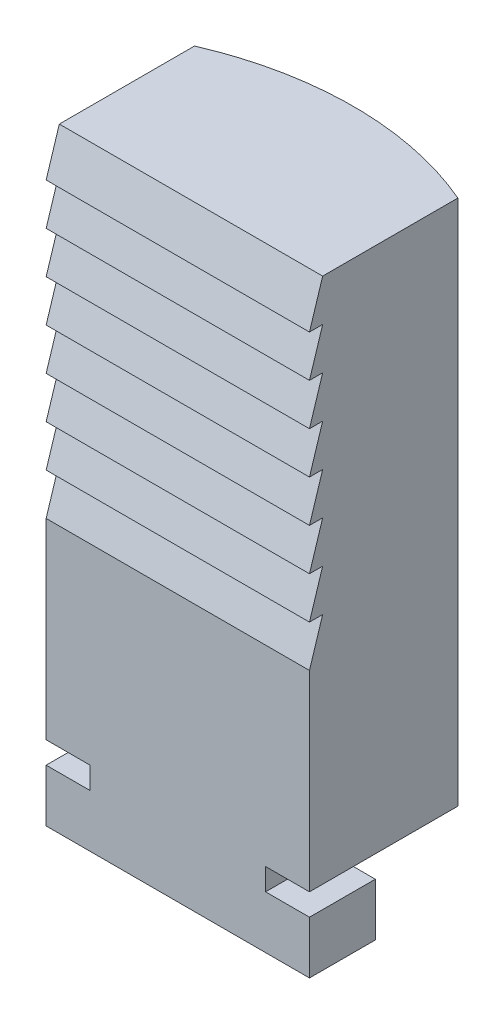
ISO-10303-21;
HEADER;
FILE_DESCRIPTION(('STEP AP214'),'2;1');
FILE_NAME('part.step','',(''),(''),'','','');
FILE_SCHEMA(('AUTOMOTIVE_DESIGN { 1 0 10303 214 1 1 1 1 }'));
ENDSEC;
DATA;
#1=APPLICATION_CONTEXT('core data for automotive mechanical design processes');
#2=APPLICATION_PROTOCOL_DEFINITION('international standard','automotive_design',2000,#1);
#3=PRODUCT_CONTEXT('',#1,'mechanical');
#4=PRODUCT('Part','Part','',(#3));
#5=PRODUCT_RELATED_PRODUCT_CATEGORY('part','',(#4));
#6=PRODUCT_DEFINITION_FORMATION('','',#4);
#7=PRODUCT_DEFINITION_CONTEXT('part definition',#1,'design');
#8=PRODUCT_DEFINITION('design','',#6,#7);
#9=PRODUCT_DEFINITION_SHAPE('','',#8);
#10=(LENGTH_UNIT() NAMED_UNIT(*) SI_UNIT(.MILLI.,.METRE.));
#11=(NAMED_UNIT(*) PLANE_ANGLE_UNIT() SI_UNIT($,.RADIAN.));
#12=(NAMED_UNIT(*) SI_UNIT($,.STERADIAN.) SOLID_ANGLE_UNIT());
#13=UNCERTAINTY_MEASURE_WITH_UNIT(LENGTH_MEASURE(1.E-05),#10,'distance_accuracy_value','');
#14=(GEOMETRIC_REPRESENTATION_CONTEXT(3) GLOBAL_UNCERTAINTY_ASSIGNED_CONTEXT((#13)) GLOBAL_UNIT_ASSIGNED_CONTEXT((#10,
#11,#12)) REPRESENTATION_CONTEXT('',''));
#15=CARTESIAN_POINT('',(0.,0.,0.));
#16=DIRECTION('',(0.,0.,1.));
#17=DIRECTION('',(1.,0.,0.));
#18=AXIS2_PLACEMENT_3D('',#15,#16,#17);
#19=CARTESIAN_POINT('',(0.,12.,40.));
#20=DIRECTION('',(1.,0.,0.));
#21=DIRECTION('',(0.,0.,-1.));
#22=AXIS2_PLACEMENT_3D('',#19,#20,#21);
#23=PLANE('',#22);
#24=DIRECTION('',(0.,1.,0.));
#25=VECTOR('',#24,1.);
#26=CARTESIAN_POINT('',(0.,0.,25.));
#27=LINE('',#26,#25);
#28=CARTESIAN_POINT('',(0.,0.,25.));
#29=VERTEX_POINT('',#28);
#30=CARTESIAN_POINT('',(0.,12.,25.));
#31=VERTEX_POINT('',#30);
#32=EDGE_CURVE('E289',#29,#31,#27,.T.);
#33=ORIENTED_EDGE('',*,*,#32,.F.);
#34=DIRECTION('',(0.,0.,-1.));
#35=VECTOR('',#34,1.);
#36=CARTESIAN_POINT('',(0.,0.,40.));
#37=LINE('',#36,#35);
#38=CARTESIAN_POINT('',(0.,0.,40.));
#39=VERTEX_POINT('',#38);
#40=EDGE_CURVE('E11',#39,#29,#37,.T.);
#41=ORIENTED_EDGE('',*,*,#40,.F.);
#42=DIRECTION('',(0.,-1.,0.));
#43=VECTOR('',#42,1.);
#44=CARTESIAN_POINT('',(0.,12.,40.));
#45=LINE('',#44,#43);
#46=CARTESIAN_POINT('',(0.,12.,40.));
#47=VERTEX_POINT('',#46);
#48=EDGE_CURVE('E462',#47,#39,#45,.T.);
#49=ORIENTED_EDGE('',*,*,#48,.F.);
#50=DIRECTION('',(0.,0.,-1.));
#51=VECTOR('',#50,1.);
#52=CARTESIAN_POINT('',(0.,12.,40.));
#53=LINE('',#52,#51);
#54=EDGE_CURVE('E494',#47,#31,#53,.T.);
#55=ORIENTED_EDGE('',*,*,#54,.T.);
#56=EDGE_LOOP('',(#33,#41,#49,#55));
#57=FACE_BOUND('',#56,.T.);
#58=ADVANCED_FACE('F43',(#57),#23,.F.);
#59=CARTESIAN_POINT('',(0.,0.,40.));
#60=DIRECTION('',(0.,1.,0.));
#61=DIRECTION('',(0.,0.,1.));
#62=AXIS2_PLACEMENT_3D('',#59,#60,#61);
#63=PLANE('',#62);
#64=DIRECTION('',(-1.,0.,0.));
#65=VECTOR('',#64,1.);
#66=CARTESIAN_POINT('',(60.,0.,25.));
#67=LINE('',#66,#65);
#68=CARTESIAN_POINT('',(60.,0.,25.));
#69=VERTEX_POINT('',#68);
#70=EDGE_CURVE('E284',#69,#29,#67,.T.);
#71=ORIENTED_EDGE('',*,*,#70,.F.);
#72=DIRECTION('',(0.,0.,-1.));
#73=VECTOR('',#72,1.);
#74=CARTESIAN_POINT('',(60.,0.,40.));
#75=LINE('',#74,#73);
#76=CARTESIAN_POINT('',(60.,0.,40.));
#77=VERTEX_POINT('',#76);
#78=EDGE_CURVE('E51',#77,#69,#75,.T.);
#79=ORIENTED_EDGE('',*,*,#78,.F.);
#80=DIRECTION('',(1.,0.,0.));
#81=VECTOR('',#80,1.);
#82=CARTESIAN_POINT('',(0.,0.,40.));
#83=LINE('',#82,#81);
#84=EDGE_CURVE('E282',#39,#77,#83,.T.);
#85=ORIENTED_EDGE('',*,*,#84,.F.);
#86=ORIENTED_EDGE('',*,*,#40,.T.);
#87=EDGE_LOOP('',(#71,#79,#85,#86));
#88=FACE_BOUND('',#87,.T.);
#89=ADVANCED_FACE('F281',(#88),#63,.F.);
#90=CARTESIAN_POINT('',(60.,0.,40.));
#91=DIRECTION('',(-1.,0.,0.));
#92=DIRECTION('',(0.,0.,1.));
#93=AXIS2_PLACEMENT_3D('',#90,#91,#92);
#94=PLANE('',#93);
#95=DIRECTION('',(0.,-1.,0.));
#96=VECTOR('',#95,1.);
#97=CARTESIAN_POINT('',(60.,12.,25.));
#98=LINE('',#97,#96);
#99=CARTESIAN_POINT('',(60.,12.,25.));
#100=VERTEX_POINT('',#99);
#101=EDGE_CURVE('E277',#100,#69,#98,.T.);
#102=ORIENTED_EDGE('',*,*,#101,.F.);
#103=DIRECTION('',(0.,0.,-1.));
#104=VECTOR('',#103,1.);
#105=CARTESIAN_POINT('',(60.,12.,40.));
#106=LINE('',#105,#104);
#107=CARTESIAN_POINT('',(60.,12.,40.));
#108=VERTEX_POINT('',#107);
#109=EDGE_CURVE('E266',#108,#100,#106,.T.);
#110=ORIENTED_EDGE('',*,*,#109,.F.);
#111=DIRECTION('',(0.,1.,0.));
#112=VECTOR('',#111,1.);
#113=CARTESIAN_POINT('',(60.,0.,40.));
#114=LINE('',#113,#112);
#115=EDGE_CURVE('E278',#77,#108,#114,.T.);
#116=ORIENTED_EDGE('',*,*,#115,.F.);
#117=ORIENTED_EDGE('',*,*,#78,.T.);
#118=EDGE_LOOP('',(#102,#110,#116,#117));
#119=FACE_BOUND('',#118,.T.);
#120=ADVANCED_FACE('F275',(#119),#94,.F.);
#121=CARTESIAN_POINT('',(60.,12.,40.));
#122=DIRECTION('',(0.,-1.,0.));
#123=DIRECTION('',(1.,0.,0.));
#124=AXIS2_PLACEMENT_3D('',#121,#122,#123);
#125=PLANE('',#124);
#126=DIRECTION('',(1.,0.,0.));
#127=VECTOR('',#126,1.);
#128=CARTESIAN_POINT('',(50.,12.,25.));
#129=LINE('',#128,#127);
#130=CARTESIAN_POINT('',(50.,12.,25.));
#131=VERTEX_POINT('',#130);
#132=EDGE_CURVE('E310',#131,#100,#129,.T.);
#133=ORIENTED_EDGE('',*,*,#132,.F.);
#134=DIRECTION('',(0.,0.,-1.));
#135=VECTOR('',#134,1.);
#136=CARTESIAN_POINT('',(50.,12.,40.));
#137=LINE('',#136,#135);
#138=CARTESIAN_POINT('',(50.,12.,40.));
#139=VERTEX_POINT('',#138);
#140=EDGE_CURVE('E262',#139,#131,#137,.T.);
#141=ORIENTED_EDGE('',*,*,#140,.F.);
#142=DIRECTION('',(-1.,0.,0.));
#143=VECTOR('',#142,1.);
#144=CARTESIAN_POINT('',(60.,12.,40.));
#145=LINE('',#144,#143);
#146=EDGE_CURVE('E469',#108,#139,#145,.T.);
#147=ORIENTED_EDGE('',*,*,#146,.F.);
#148=ORIENTED_EDGE('',*,*,#109,.T.);
#149=EDGE_LOOP('',(#133,#141,#147,#148));
#150=FACE_BOUND('',#149,.T.);
#151=ADVANCED_FACE('F598',(#150),#125,.F.);
#152=CARTESIAN_POINT('',(50.,12.,40.));
#153=DIRECTION('',(-1.,0.,0.));
#154=DIRECTION('',(0.,0.,1.));
#155=AXIS2_PLACEMENT_3D('',#152,#153,#154);
#156=PLANE('',#155);
#157=DIRECTION('',(0.,-1.,0.));
#158=VECTOR('',#157,1.);
#159=CARTESIAN_POINT('',(50.,17.,25.));
#160=LINE('',#159,#158);
#161=CARTESIAN_POINT('',(50.,17.,25.));
#162=VERTEX_POINT('',#161);
#163=EDGE_CURVE('E307',#162,#131,#160,.T.);
#164=ORIENTED_EDGE('',*,*,#163,.F.);
#165=DIRECTION('',(0.,0.,-1.));
#166=VECTOR('',#165,1.);
#167=CARTESIAN_POINT('',(50.,17.,40.));
#168=LINE('',#167,#166);
#169=CARTESIAN_POINT('',(50.,17.,40.));
#170=VERTEX_POINT('',#169);
#171=EDGE_CURVE('E253',#170,#162,#168,.T.);
#172=ORIENTED_EDGE('',*,*,#171,.F.);
#173=DIRECTION('',(0.,1.,0.));
#174=VECTOR('',#173,1.);
#175=CARTESIAN_POINT('',(50.,12.,40.));
#176=LINE('',#175,#174);
#177=EDGE_CURVE('E472',#139,#170,#176,.T.);
#178=ORIENTED_EDGE('',*,*,#177,.F.);
#179=ORIENTED_EDGE('',*,*,#140,.T.);
#180=EDGE_LOOP('',(#164,#172,#178,#179));
#181=FACE_BOUND('',#180,.T.);
#182=ADVANCED_FACE('F593',(#181),#156,.F.);
#183=CARTESIAN_POINT('',(10.,17.,40.));
#184=DIRECTION('',(1.,0.,0.));
#185=DIRECTION('',(0.,0.,-1.));
#186=AXIS2_PLACEMENT_3D('',#183,#184,#185);
#187=PLANE('',#186);
#188=DIRECTION('',(0.,1.,0.));
#189=VECTOR('',#188,1.);
#190=CARTESIAN_POINT('',(10.,12.,25.));
#191=LINE('',#190,#189);
#192=CARTESIAN_POINT('',(10.,12.,25.));
#193=VERTEX_POINT('',#192);
#194=CARTESIAN_POINT('',(10.,17.,25.));
#195=VERTEX_POINT('',#194);
#196=EDGE_CURVE('E300',#193,#195,#191,.T.);
#197=ORIENTED_EDGE('',*,*,#196,.F.);
#198=DIRECTION('',(0.,0.,-1.));
#199=VECTOR('',#198,1.);
#200=CARTESIAN_POINT('',(10.,12.,40.));
#201=LINE('',#200,#199);
#202=CARTESIAN_POINT('',(10.,12.,40.));
#203=VERTEX_POINT('',#202);
#204=EDGE_CURVE('E498',#203,#193,#201,.T.);
#205=ORIENTED_EDGE('',*,*,#204,.F.);
#206=DIRECTION('',(0.,-1.,0.));
#207=VECTOR('',#206,1.);
#208=CARTESIAN_POINT('',(10.,17.,40.));
#209=LINE('',#208,#207);
#210=CARTESIAN_POINT('',(10.,17.,40.));
#211=VERTEX_POINT('',#210);
#212=EDGE_CURVE('E488',#211,#203,#209,.T.);
#213=ORIENTED_EDGE('',*,*,#212,.F.);
#214=DIRECTION('',(0.,0.,-1.));
#215=VECTOR('',#214,1.);
#216=CARTESIAN_POINT('',(10.,17.,40.));
#217=LINE('',#216,#215);
#218=EDGE_CURVE('E502',#211,#195,#217,.T.);
#219=ORIENTED_EDGE('',*,*,#218,.T.);
#220=EDGE_LOOP('',(#197,#205,#213,#219));
#221=FACE_BOUND('',#220,.T.);
#222=ADVANCED_FACE('F611',(#221),#187,.F.);
#223=CARTESIAN_POINT('',(10.,12.,40.));
#224=DIRECTION('',(0.,-1.,0.));
#225=DIRECTION('',(0.,0.,-1.));
#226=AXIS2_PLACEMENT_3D('',#223,#224,#225);
#227=PLANE('',#226);
#228=DIRECTION('',(1.,0.,0.));
#229=VECTOR('',#228,1.);
#230=CARTESIAN_POINT('',(0.,12.,25.));
#231=LINE('',#230,#229);
#232=EDGE_CURVE('E293',#31,#193,#231,.T.);
#233=ORIENTED_EDGE('',*,*,#232,.F.);
#234=ORIENTED_EDGE('',*,*,#54,.F.);
#235=DIRECTION('',(-1.,0.,0.));
#236=VECTOR('',#235,1.);
#237=CARTESIAN_POINT('',(10.,12.,40.));
#238=LINE('',#237,#236);
#239=EDGE_CURVE('E491',#203,#47,#238,.T.);
#240=ORIENTED_EDGE('',*,*,#239,.F.);
#241=ORIENTED_EDGE('',*,*,#204,.T.);
#242=EDGE_LOOP('',(#233,#234,#240,#241));
#243=FACE_BOUND('',#242,.T.);
#244=ADVANCED_FACE('F607',(#243),#227,.F.);
#245=CARTESIAN_POINT('',(60.,17.,40.));
#246=DIRECTION('',(-1.,0.,0.));
#247=DIRECTION('',(0.,0.,1.));
#248=AXIS2_PLACEMENT_3D('',#245,#246,#247);
#249=PLANE('',#248);
#250=DIRECTION('',(0.,0.,-1.));
#251=VECTOR('',#250,1.);
#252=CARTESIAN_POINT('',(60.,17.,40.));
#253=LINE('',#252,#251);
#254=CARTESIAN_POINT('',(60.,17.,40.));
#255=VERTEX_POINT('',#254);
#256=CARTESIAN_POINT('',(60.,17.,6.19377739427172));
#257=VERTEX_POINT('',#256);
#258=EDGE_CURVE('E242',#255,#257,#253,.T.);
#259=ORIENTED_EDGE('',*,*,#258,.T.);
#260=DIRECTION('',(0.,1.,0.));
#261=VECTOR('',#260,1.);
#262=CARTESIAN_POINT('',(60.,0.,6.19377739427172));
#263=LINE('',#262,#261);
#264=CARTESIAN_POINT('',(60.,137.,6.19377739427172));
#265=VERTEX_POINT('',#264);
#266=EDGE_CURVE('E226',#257,#265,#263,.T.);
#267=ORIENTED_EDGE('',*,*,#266,.T.);
#268=DIRECTION('',(0.,0.,-1.));
#269=VECTOR('',#268,1.);
#270=CARTESIAN_POINT('',(60.,137.,40.));
#271=LINE('',#270,#269);
#272=CARTESIAN_POINT('',(60.,137.,37.0000000000003));
#273=VERTEX_POINT('',#272);
#274=EDGE_CURVE('E240',#273,#265,#271,.T.);
#275=ORIENTED_EDGE('',*,*,#274,.F.);
#276=DIRECTION('',(0.,0.953939201416954,-0.299999999999975));
#277=VECTOR('',#276,1.);
#278=CARTESIAN_POINT('',(60.,137.,37.0000000000003));
#279=LINE('',#278,#277);
#280=CARTESIAN_POINT('',(60.,127.460607985831,40.));
#281=VERTEX_POINT('',#280);
#282=EDGE_CURVE('E355',#281,#273,#279,.T.);
#283=ORIENTED_EDGE('',*,*,#282,.F.);
#284=DIRECTION('',(0.,0.,1.));
#285=VECTOR('',#284,1.);
#286=CARTESIAN_POINT('',(60.,127.460607985831,40.));
#287=LINE('',#286,#285);
#288=CARTESIAN_POINT('',(60.,127.460607985831,37.0000000000001));
#289=VERTEX_POINT('',#288);
#290=EDGE_CURVE('E352',#289,#281,#287,.T.);
#291=ORIENTED_EDGE('',*,*,#290,.F.);
#292=DIRECTION('',(0.,0.953939201416951,-0.299999999999982));
#293=VECTOR('',#292,1.);
#294=CARTESIAN_POINT('',(60.,127.460607985831,37.0000000000001));
#295=LINE('',#294,#293);
#296=CARTESIAN_POINT('',(60.,117.921215971661,40.0000000000001));
#297=VERTEX_POINT('',#296);
#298=EDGE_CURVE('E349',#297,#289,#295,.T.);
#299=ORIENTED_EDGE('',*,*,#298,.F.);
#300=DIRECTION('',(0.,0.,1.));
#301=VECTOR('',#300,1.);
#302=CARTESIAN_POINT('',(60.,117.921215971661,40.0000000000001));
#303=LINE('',#302,#301);
#304=CARTESIAN_POINT('',(60.,117.921215971661,37.0000000000001));
#305=VERTEX_POINT('',#304);
#306=EDGE_CURVE('E346',#305,#297,#303,.T.);
#307=ORIENTED_EDGE('',*,*,#306,.F.);
#308=DIRECTION('',(0.,0.953939201416952,-0.29999999999998));
#309=VECTOR('',#308,1.);
#310=CARTESIAN_POINT('',(60.,117.921215971661,37.0000000000001));
#311=LINE('',#310,#309);
#312=CARTESIAN_POINT('',(60.,108.381823957491,40.));
#313=VERTEX_POINT('',#312);
#314=EDGE_CURVE('E343',#313,#305,#311,.T.);
#315=ORIENTED_EDGE('',*,*,#314,.F.);
#316=DIRECTION('',(0.,0.,1.));
#317=VECTOR('',#316,1.);
#318=CARTESIAN_POINT('',(60.,108.381823957491,40.));
#319=LINE('',#318,#317);
#320=CARTESIAN_POINT('',(60.,108.381823957491,37.));
#321=VERTEX_POINT('',#320);
#322=EDGE_CURVE('E340',#321,#313,#319,.T.);
#323=ORIENTED_EDGE('',*,*,#322,.F.);
#324=DIRECTION('',(0.,0.953939201416951,-0.299999999999982));
#325=VECTOR('',#324,1.);
#326=CARTESIAN_POINT('',(60.,108.381823957491,37.));
#327=LINE('',#326,#325);
#328=CARTESIAN_POINT('',(60.,98.8424319433208,40.0000000000001));
#329=VERTEX_POINT('',#328);
#330=EDGE_CURVE('E337',#329,#321,#327,.T.);
#331=ORIENTED_EDGE('',*,*,#330,.F.);
#332=DIRECTION('',(0.,0.,1.));
#333=VECTOR('',#332,1.);
#334=CARTESIAN_POINT('',(60.,98.8424319433208,40.0000000000001));
#335=LINE('',#334,#333);
#336=CARTESIAN_POINT('',(60.,98.8424319433208,37.));
#337=VERTEX_POINT('',#336);
#338=EDGE_CURVE('E334',#337,#329,#335,.T.);
#339=ORIENTED_EDGE('',*,*,#338,.F.);
#340=DIRECTION('',(0.,0.953939201416952,-0.299999999999979));
#341=VECTOR('',#340,1.);
#342=CARTESIAN_POINT('',(60.,98.8424319433208,37.));
#343=LINE('',#342,#341);
#344=CARTESIAN_POINT('',(60.,89.3030399291507,40.));
#345=VERTEX_POINT('',#344);
#346=EDGE_CURVE('E331',#345,#337,#343,.T.);
#347=ORIENTED_EDGE('',*,*,#346,.F.);
#348=DIRECTION('',(0.,0.,1.));
#349=VECTOR('',#348,1.);
#350=CARTESIAN_POINT('',(60.,89.3030399291507,40.));
#351=LINE('',#350,#349);
#352=CARTESIAN_POINT('',(60.,89.3030399291507,37.));
#353=VERTEX_POINT('',#352);
#354=EDGE_CURVE('E328',#353,#345,#351,.T.);
#355=ORIENTED_EDGE('',*,*,#354,.F.);
#356=DIRECTION('',(0.,0.953939201416952,-0.29999999999998));
#357=VECTOR('',#356,1.);
#358=CARTESIAN_POINT('',(60.,89.3030399291507,37.));
#359=LINE('',#358,#357);
#360=CARTESIAN_POINT('',(60.,79.7636479149805,40.));
#361=VERTEX_POINT('',#360);
#362=EDGE_CURVE('E325',#361,#353,#359,.T.);
#363=ORIENTED_EDGE('',*,*,#362,.F.);
#364=DIRECTION('',(0.,0.,1.));
#365=VECTOR('',#364,1.);
#366=CARTESIAN_POINT('',(60.,79.7636479149805,40.));
#367=LINE('',#366,#365);
#368=CARTESIAN_POINT('',(60.,79.7636479149805,37.));
#369=VERTEX_POINT('',#368);
#370=EDGE_CURVE('E322',#369,#361,#367,.T.);
#371=ORIENTED_EDGE('',*,*,#370,.F.);
#372=DIRECTION('',(0.,0.953939201416952,-0.299999999999979));
#373=VECTOR('',#372,1.);
#374=CARTESIAN_POINT('',(60.,79.7636479149805,37.));
#375=LINE('',#374,#373);
#376=CARTESIAN_POINT('',(60.,70.2242559008102,40.));
#377=VERTEX_POINT('',#376);
#378=EDGE_CURVE('E319',#377,#369,#375,.T.);
#379=ORIENTED_EDGE('',*,*,#378,.F.);
#380=DIRECTION('',(0.,0.,1.));
#381=VECTOR('',#380,1.);
#382=CARTESIAN_POINT('',(60.,70.2242559008102,40.));
#383=LINE('',#382,#381);
#384=CARTESIAN_POINT('',(60.,70.2242559008102,37.));
#385=VERTEX_POINT('',#384);
#386=EDGE_CURVE('E316',#385,#377,#383,.T.);
#387=ORIENTED_EDGE('',*,*,#386,.F.);
#388=DIRECTION('',(0.,0.953939201416953,-0.299999999999977));
#389=VECTOR('',#388,1.);
#390=CARTESIAN_POINT('',(60.,70.2242559008102,37.));
#391=LINE('',#390,#389);
#392=CARTESIAN_POINT('',(60.,60.6848638866399,40.));
#393=VERTEX_POINT('',#392);
#394=EDGE_CURVE('E313',#393,#385,#391,.T.);
#395=ORIENTED_EDGE('',*,*,#394,.F.);
#396=DIRECTION('',(0.,1.,0.));
#397=VECTOR('',#396,1.);
#398=CARTESIAN_POINT('',(60.,17.,40.));
#399=LINE('',#398,#397);
#400=EDGE_CURVE('E478',#255,#393,#399,.T.);
#401=ORIENTED_EDGE('',*,*,#400,.F.);
#402=EDGE_LOOP('',(#259,#267,#275,#283,#291,#299,#307,#315,#323,#331,#339,#347,#355,#363,#371,
#379,#387,#395,#401));
#403=FACE_BOUND('',#402,.T.);
#404=ADVANCED_FACE('F238',(#403),#249,.F.);
#405=CARTESIAN_POINT('',(60.,137.,40.));
#406=DIRECTION('',(0.,-1.,0.));
#407=DIRECTION('',(0.,0.,-1.));
#408=AXIS2_PLACEMENT_3D('',#405,#406,#407);
#409=PLANE('',#408);
#410=CARTESIAN_POINT('',(30.,137.,75.7504523231356));
#411=DIRECTION('',(0.,-1.,0.));
#412=DIRECTION('',(0.,0.,1.));
#413=AXIS2_PLACEMENT_3D('',#410,#411,#412);
#414=CIRCLE('',#413,75.7504523231356);
#415=CARTESIAN_POINT('',(0.,137.,6.19377739427172));
#416=VERTEX_POINT('',#415);
#417=EDGE_CURVE('E223',#416,#265,#414,.T.);
#418=ORIENTED_EDGE('',*,*,#417,.F.);
#419=DIRECTION('',(0.,0.,-1.));
#420=VECTOR('',#419,1.);
#421=CARTESIAN_POINT('',(0.,137.,40.));
#422=LINE('',#421,#420);
#423=CARTESIAN_POINT('',(0.,137.,37.0000000000003));
#424=VERTEX_POINT('',#423);
#425=EDGE_CURVE('E249',#424,#416,#422,.T.);
#426=ORIENTED_EDGE('',*,*,#425,.F.);
#427=DIRECTION('',(-1.,0.,0.));
#428=VECTOR('',#427,1.);
#429=CARTESIAN_POINT('',(60.,137.,37.0000000000003));
#430=LINE('',#429,#428);
#431=EDGE_CURVE('E247',#273,#424,#430,.T.);
#432=ORIENTED_EDGE('',*,*,#431,.F.);
#433=ORIENTED_EDGE('',*,*,#274,.T.);
#434=EDGE_LOOP('',(#418,#426,#432,#433));
#435=FACE_BOUND('',#434,.T.);
#436=ADVANCED_FACE('F246',(#435),#409,.F.);
#437=CARTESIAN_POINT('',(0.,137.,40.));
#438=DIRECTION('',(1.,0.,0.));
#439=DIRECTION('',(0.,0.,-1.));
#440=AXIS2_PLACEMENT_3D('',#437,#438,#439);
#441=PLANE('',#440);
#442=ORIENTED_EDGE('',*,*,#425,.T.);
#443=DIRECTION('',(0.,1.,0.));
#444=VECTOR('',#443,1.);
#445=CARTESIAN_POINT('',(0.,0.,6.19377739427172));
#446=LINE('',#445,#444);
#447=CARTESIAN_POINT('',(0.,17.,6.19377739427172));
#448=VERTEX_POINT('',#447);
#449=EDGE_CURVE('E229',#448,#416,#446,.T.);
#450=ORIENTED_EDGE('',*,*,#449,.F.);
#451=DIRECTION('',(0.,0.,-1.));
#452=VECTOR('',#451,1.);
#453=CARTESIAN_POINT('',(0.,17.,40.));
#454=LINE('',#453,#452);
#455=CARTESIAN_POINT('',(0.,17.,40.));
#456=VERTEX_POINT('',#455);
#457=EDGE_CURVE('E255',#456,#448,#454,.T.);
#458=ORIENTED_EDGE('',*,*,#457,.F.);
#459=DIRECTION('',(0.,-1.,0.));
#460=VECTOR('',#459,1.);
#461=CARTESIAN_POINT('',(0.,137.,40.));
#462=LINE('',#461,#460);
#463=CARTESIAN_POINT('',(0.,60.68486388664,40.));
#464=VERTEX_POINT('',#463);
#465=EDGE_CURVE('E482',#464,#456,#462,.T.);
#466=ORIENTED_EDGE('',*,*,#465,.F.);
#467=DIRECTION('',(0.,-0.953939201416953,0.299999999999977));
#468=VECTOR('',#467,1.);
#469=CARTESIAN_POINT('',(0.,130.131637749799,18.1600000000002));
#470=LINE('',#469,#468);
#471=CARTESIAN_POINT('',(0.,70.2242559008102,37.));
#472=VERTEX_POINT('',#471);
#473=EDGE_CURVE('E66',#472,#464,#470,.T.);
#474=ORIENTED_EDGE('',*,*,#473,.F.);
#475=DIRECTION('',(0.,0.,-1.));
#476=VECTOR('',#475,1.);
#477=CARTESIAN_POINT('',(0.,70.2242559008102,40.));
#478=LINE('',#477,#476);
#479=CARTESIAN_POINT('',(0.,70.2242559008102,40.));
#480=VERTEX_POINT('',#479);
#481=EDGE_CURVE('E457',#480,#472,#478,.T.);
#482=ORIENTED_EDGE('',*,*,#481,.F.);
#483=DIRECTION('',(0.,-0.953939201416952,0.299999999999979));
#484=VECTOR('',#483,1.);
#485=CARTESIAN_POINT('',(0.,130.990183031074,20.8900000000002));
#486=LINE('',#485,#484);
#487=CARTESIAN_POINT('',(0.,79.7636479149805,37.));
#488=VERTEX_POINT('',#487);
#489=EDGE_CURVE('E454',#488,#480,#486,.T.);
#490=ORIENTED_EDGE('',*,*,#489,.F.);
#491=DIRECTION('',(0.,0.,-1.));
#492=VECTOR('',#491,1.);
#493=CARTESIAN_POINT('',(0.,79.7636479149805,40.));
#494=LINE('',#493,#492);
#495=CARTESIAN_POINT('',(0.,79.7636479149805,40.));
#496=VERTEX_POINT('',#495);
#497=EDGE_CURVE('E451',#496,#488,#494,.T.);
#498=ORIENTED_EDGE('',*,*,#497,.F.);
#499=DIRECTION('',(0.,-0.953939201416952,0.29999999999998));
#500=VECTOR('',#499,1.);
#501=CARTESIAN_POINT('',(0.,131.848728312349,23.6200000000002));
#502=LINE('',#501,#500);
#503=CARTESIAN_POINT('',(0.,89.3030399291507,37.));
#504=VERTEX_POINT('',#503);
#505=EDGE_CURVE('E448',#504,#496,#502,.T.);
#506=ORIENTED_EDGE('',*,*,#505,.F.);
#507=DIRECTION('',(0.,0.,-1.));
#508=VECTOR('',#507,1.);
#509=CARTESIAN_POINT('',(0.,89.3030399291507,39.9999999999998));
#510=LINE('',#509,#508);
#511=CARTESIAN_POINT('',(0.,89.3030399291507,40.));
#512=VERTEX_POINT('',#511);
#513=EDGE_CURVE('E445',#512,#504,#510,.T.);
#514=ORIENTED_EDGE('',*,*,#513,.F.);
#515=DIRECTION('',(0.,-0.953939201416952,0.299999999999979));
#516=VECTOR('',#515,1.);
#517=CARTESIAN_POINT('',(0.,132.707273593624,26.3500000000003));
#518=LINE('',#517,#516);
#519=CARTESIAN_POINT('',(0.,98.8424319433208,37.));
#520=VERTEX_POINT('',#519);
#521=EDGE_CURVE('E442',#520,#512,#518,.T.);
#522=ORIENTED_EDGE('',*,*,#521,.F.);
#523=DIRECTION('',(0.,0.,-1.));
#524=VECTOR('',#523,1.);
#525=CARTESIAN_POINT('',(0.,98.8424319433208,39.9999999999996));
#526=LINE('',#525,#524);
#527=CARTESIAN_POINT('',(0.,98.8424319433208,40.0000000000001));
#528=VERTEX_POINT('',#527);
#529=EDGE_CURVE('E439',#528,#520,#526,.T.);
#530=ORIENTED_EDGE('',*,*,#529,.F.);
#531=DIRECTION('',(0.,-0.953939201416951,0.299999999999982));
#532=VECTOR('',#531,1.);
#533=CARTESIAN_POINT('',(0.,133.565818874899,29.0800000000002));
#534=LINE('',#533,#532);
#535=CARTESIAN_POINT('',(0.,108.381823957491,37.));
#536=VERTEX_POINT('',#535);
#537=EDGE_CURVE('E436',#536,#528,#534,.T.);
#538=ORIENTED_EDGE('',*,*,#537,.F.);
#539=DIRECTION('',(0.,0.,-1.));
#540=VECTOR('',#539,1.);
#541=CARTESIAN_POINT('',(0.,108.381823957491,40.));
#542=LINE('',#541,#540);
#543=CARTESIAN_POINT('',(0.,108.381823957491,40.));
#544=VERTEX_POINT('',#543);
#545=EDGE_CURVE('E433',#544,#536,#542,.T.);
#546=ORIENTED_EDGE('',*,*,#545,.F.);
#547=DIRECTION('',(0.,-0.953939201416952,0.29999999999998));
#548=VECTOR('',#547,1.);
#549=CARTESIAN_POINT('',(0.,134.424364156175,31.8100000000003));
#550=LINE('',#549,#548);
#551=CARTESIAN_POINT('',(0.,117.921215971661,37.0000000000001));
#552=VERTEX_POINT('',#551);
#553=EDGE_CURVE('E430',#552,#544,#550,.T.);
#554=ORIENTED_EDGE('',*,*,#553,.F.);
#555=DIRECTION('',(0.,0.,-1.));
#556=VECTOR('',#555,1.);
#557=CARTESIAN_POINT('',(0.,117.921215971661,39.9999999999998));
#558=LINE('',#557,#556);
#559=CARTESIAN_POINT('',(0.,117.921215971661,40.0000000000001));
#560=VERTEX_POINT('',#559);
#561=EDGE_CURVE('E427',#560,#552,#558,.T.);
#562=ORIENTED_EDGE('',*,*,#561,.F.);
#563=DIRECTION('',(0.,-0.953939201416951,0.299999999999982));
#564=VECTOR('',#563,1.);
#565=CARTESIAN_POINT('',(0.,135.28290943745,34.5400000000002));
#566=LINE('',#565,#564);
#567=CARTESIAN_POINT('',(0.,127.460607985831,37.0000000000001));
#568=VERTEX_POINT('',#567);
#569=EDGE_CURVE('E424',#568,#560,#566,.T.);
#570=ORIENTED_EDGE('',*,*,#569,.F.);
#571=DIRECTION('',(0.,0.,-1.));
#572=VECTOR('',#571,1.);
#573=CARTESIAN_POINT('',(0.,127.460607985831,39.9999999999997));
#574=LINE('',#573,#572);
#575=CARTESIAN_POINT('',(0.,127.460607985831,40.));
#576=VERTEX_POINT('',#575);
#577=EDGE_CURVE('E421',#576,#568,#574,.T.);
#578=ORIENTED_EDGE('',*,*,#577,.F.);
#579=DIRECTION('',(0.,-0.953939201416954,0.299999999999975));
#580=VECTOR('',#579,1.);
#581=CARTESIAN_POINT('',(0.,136.141454718725,37.2700000000002));
#582=LINE('',#581,#580);
#583=EDGE_CURVE('E418',#424,#576,#582,.T.);
#584=ORIENTED_EDGE('',*,*,#583,.F.);
#585=EDGE_LOOP('',(#442,#450,#458,#466,#474,#482,#490,#498,#506,#514,#522,#530,#538,#546,#554,
#562,#570,#578,#584));
#586=FACE_BOUND('',#585,.T.);
#587=ADVANCED_FACE('F512',(#586),#441,.F.);
#588=CARTESIAN_POINT('',(0.,0.,40.));
#589=DIRECTION('',(0.,0.,1.));
#590=DIRECTION('',(1.,0.,0.));
#591=AXIS2_PLACEMENT_3D('',#588,#589,#590);
#592=PLANE('',#591);
#593=ORIENTED_EDGE('',*,*,#400,.T.);
#594=DIRECTION('',(-1.,0.,0.));
#595=VECTOR('',#594,1.);
#596=CARTESIAN_POINT('',(60.,60.6848638866399,40.));
#597=LINE('',#596,#595);
#598=EDGE_CURVE('E415',#393,#464,#597,.T.);
#599=ORIENTED_EDGE('',*,*,#598,.T.);
#600=ORIENTED_EDGE('',*,*,#465,.T.);
#601=DIRECTION('',(1.,0.,0.));
#602=VECTOR('',#601,1.);
#603=CARTESIAN_POINT('',(0.,17.,40.));
#604=LINE('',#603,#602);
#605=EDGE_CURVE('E485',#456,#211,#604,.T.);
#606=ORIENTED_EDGE('',*,*,#605,.T.);
#607=ORIENTED_EDGE('',*,*,#212,.T.);
#608=ORIENTED_EDGE('',*,*,#239,.T.);
#609=ORIENTED_EDGE('',*,*,#48,.T.);
#610=ORIENTED_EDGE('',*,*,#84,.T.);
#611=ORIENTED_EDGE('',*,*,#115,.T.);
#612=ORIENTED_EDGE('',*,*,#146,.T.);
#613=ORIENTED_EDGE('',*,*,#177,.T.);
#614=DIRECTION('',(1.,0.,0.));
#615=VECTOR('',#614,1.);
#616=CARTESIAN_POINT('',(50.,17.,40.));
#617=LINE('',#616,#615);
#618=EDGE_CURVE('E475',#170,#255,#617,.T.);
#619=ORIENTED_EDGE('',*,*,#618,.T.);
#620=EDGE_LOOP('',(#593,#599,#600,#606,#607,#608,#609,#610,#611,#612,#613,#619));
#621=FACE_BOUND('',#620,.T.);
#622=ADVANCED_FACE('F587',(#621),#592,.T.);
#623=CARTESIAN_POINT('',(0.,17.,40.));
#624=DIRECTION('',(0.,1.,0.));
#625=DIRECTION('',(0.,0.,1.));
#626=AXIS2_PLACEMENT_3D('',#623,#624,#625);
#627=PLANE('',#626);
#628=ORIENTED_EDGE('',*,*,#457,.T.);
#629=CARTESIAN_POINT('',(30.,17.,75.7504523231356));
#630=DIRECTION('',(0.,1.,0.));
#631=DIRECTION('',(0.,0.,1.));
#632=AXIS2_PLACEMENT_3D('',#629,#630,#631);
#633=CIRCLE('',#632,75.7504523231356);
#634=EDGE_CURVE('E58',#448,#257,#633,.F.);
#635=ORIENTED_EDGE('',*,*,#634,.T.);
#636=ORIENTED_EDGE('',*,*,#258,.F.);
#637=ORIENTED_EDGE('',*,*,#618,.F.);
#638=ORIENTED_EDGE('',*,*,#171,.T.);
#639=DIRECTION('',(1.,0.,0.));
#640=VECTOR('',#639,1.);
#641=CARTESIAN_POINT('',(10.,17.,25.));
#642=LINE('',#641,#640);
#643=EDGE_CURVE('E304',#195,#162,#642,.T.);
#644=ORIENTED_EDGE('',*,*,#643,.F.);
#645=ORIENTED_EDGE('',*,*,#218,.F.);
#646=ORIENTED_EDGE('',*,*,#605,.F.);
#647=EDGE_LOOP('',(#628,#635,#636,#637,#638,#644,#645,#646));
#648=FACE_BOUND('',#647,.T.);
#649=ADVANCED_FACE('F508',(#648),#627,.F.);
#650=CARTESIAN_POINT('',(60.,70.2242559008102,37.));
#651=DIRECTION('',(0.,0.299999999999977,0.953939201416953));
#652=DIRECTION('',(0.,-0.953939201416953,0.299999999999977));
#653=AXIS2_PLACEMENT_3D('',#650,#651,#652);
#654=PLANE('',#653);
#655=ORIENTED_EDGE('',*,*,#473,.T.);
#656=ORIENTED_EDGE('',*,*,#598,.F.);
#657=ORIENTED_EDGE('',*,*,#394,.T.);
#658=DIRECTION('',(-1.,0.,0.));
#659=VECTOR('',#658,1.);
#660=CARTESIAN_POINT('',(60.,70.2242559008102,37.));
#661=LINE('',#660,#659);
#662=EDGE_CURVE('E412',#385,#472,#661,.T.);
#663=ORIENTED_EDGE('',*,*,#662,.T.);
#664=EDGE_LOOP('',(#655,#656,#657,#663));
#665=FACE_BOUND('',#664,.T.);
#666=ADVANCED_FACE('F638',(#665),#654,.T.);
#667=CARTESIAN_POINT('',(60.,70.2242559008102,40.));
#668=DIRECTION('',(0.,-1.,0.));
#669=DIRECTION('',(0.,0.,-1.));
#670=AXIS2_PLACEMENT_3D('',#667,#668,#669);
#671=PLANE('',#670);
#672=ORIENTED_EDGE('',*,*,#481,.T.);
#673=ORIENTED_EDGE('',*,*,#662,.F.);
#674=ORIENTED_EDGE('',*,*,#386,.T.);
#675=DIRECTION('',(-1.,0.,0.));
#676=VECTOR('',#675,1.);
#677=CARTESIAN_POINT('',(60.,70.2242559008102,40.));
#678=LINE('',#677,#676);
#679=EDGE_CURVE('E408',#377,#480,#678,.T.);
#680=ORIENTED_EDGE('',*,*,#679,.T.);
#681=EDGE_LOOP('',(#672,#673,#674,#680));
#682=FACE_BOUND('',#681,.T.);
#683=ADVANCED_FACE('F582',(#682),#671,.T.);
#684=CARTESIAN_POINT('',(60.,79.7636479149805,37.));
#685=DIRECTION('',(0.,0.299999999999979,0.953939201416952));
#686=DIRECTION('',(0.,-0.953939201416952,0.299999999999979));
#687=AXIS2_PLACEMENT_3D('',#684,#685,#686);
#688=PLANE('',#687);
#689=ORIENTED_EDGE('',*,*,#489,.T.);
#690=ORIENTED_EDGE('',*,*,#679,.F.);
#691=ORIENTED_EDGE('',*,*,#378,.T.);
#692=DIRECTION('',(-1.,0.,0.));
#693=VECTOR('',#692,1.);
#694=CARTESIAN_POINT('',(60.,79.7636479149805,37.));
#695=LINE('',#694,#693);
#696=EDGE_CURVE('E404',#369,#488,#695,.T.);
#697=ORIENTED_EDGE('',*,*,#696,.T.);
#698=EDGE_LOOP('',(#689,#690,#691,#697));
#699=FACE_BOUND('',#698,.T.);
#700=ADVANCED_FACE('F580',(#699),#688,.T.);
#701=CARTESIAN_POINT('',(60.,79.7636479149805,40.));
#702=DIRECTION('',(0.,-1.,0.));
#703=DIRECTION('',(0.,0.,-1.));
#704=AXIS2_PLACEMENT_3D('',#701,#702,#703);
#705=PLANE('',#704);
#706=ORIENTED_EDGE('',*,*,#497,.T.);
#707=ORIENTED_EDGE('',*,*,#696,.F.);
#708=ORIENTED_EDGE('',*,*,#370,.T.);
#709=DIRECTION('',(-1.,0.,0.));
#710=VECTOR('',#709,1.);
#711=CARTESIAN_POINT('',(60.,79.7636479149805,40.));
#712=LINE('',#711,#710);
#713=EDGE_CURVE('E400',#361,#496,#712,.T.);
#714=ORIENTED_EDGE('',*,*,#713,.T.);
#715=EDGE_LOOP('',(#706,#707,#708,#714));
#716=FACE_BOUND('',#715,.T.);
#717=ADVANCED_FACE('F574',(#716),#705,.T.);
#718=CARTESIAN_POINT('',(60.,89.3030399291507,37.));
#719=DIRECTION('',(0.,0.29999999999998,0.953939201416952));
#720=DIRECTION('',(0.,-0.953939201416952,0.29999999999998));
#721=AXIS2_PLACEMENT_3D('',#718,#719,#720);
#722=PLANE('',#721);
#723=ORIENTED_EDGE('',*,*,#505,.T.);
#724=ORIENTED_EDGE('',*,*,#713,.F.);
#725=ORIENTED_EDGE('',*,*,#362,.T.);
#726=DIRECTION('',(-1.,0.,0.));
#727=VECTOR('',#726,1.);
#728=CARTESIAN_POINT('',(60.,89.3030399291507,37.));
#729=LINE('',#728,#727);
#730=EDGE_CURVE('E396',#353,#504,#729,.T.);
#731=ORIENTED_EDGE('',*,*,#730,.T.);
#732=EDGE_LOOP('',(#723,#724,#725,#731));
#733=FACE_BOUND('',#732,.T.);
#734=ADVANCED_FACE('F571',(#733),#722,.T.);
#735=CARTESIAN_POINT('',(60.,89.3030399291507,40.));
#736=DIRECTION('',(0.,-1.,0.));
#737=DIRECTION('',(0.,0.,-1.));
#738=AXIS2_PLACEMENT_3D('',#735,#736,#737);
#739=PLANE('',#738);
#740=ORIENTED_EDGE('',*,*,#513,.T.);
#741=ORIENTED_EDGE('',*,*,#730,.F.);
#742=ORIENTED_EDGE('',*,*,#354,.T.);
#743=DIRECTION('',(-1.,0.,0.));
#744=VECTOR('',#743,1.);
#745=CARTESIAN_POINT('',(60.,89.3030399291507,40.));
#746=LINE('',#745,#744);
#747=EDGE_CURVE('E392',#345,#512,#746,.T.);
#748=ORIENTED_EDGE('',*,*,#747,.T.);
#749=EDGE_LOOP('',(#740,#741,#742,#748));
#750=FACE_BOUND('',#749,.T.);
#751=ADVANCED_FACE('F563',(#750),#739,.T.);
#752=CARTESIAN_POINT('',(60.,98.8424319433208,37.));
#753=DIRECTION('',(0.,0.299999999999979,0.953939201416952));
#754=DIRECTION('',(0.,-0.953939201416952,0.299999999999979));
#755=AXIS2_PLACEMENT_3D('',#752,#753,#754);
#756=PLANE('',#755);
#757=ORIENTED_EDGE('',*,*,#521,.T.);
#758=ORIENTED_EDGE('',*,*,#747,.F.);
#759=ORIENTED_EDGE('',*,*,#346,.T.);
#760=DIRECTION('',(-1.,0.,0.));
#761=VECTOR('',#760,1.);
#762=CARTESIAN_POINT('',(60.,98.8424319433208,37.));
#763=LINE('',#762,#761);
#764=EDGE_CURVE('E388',#337,#520,#763,.T.);
#765=ORIENTED_EDGE('',*,*,#764,.T.);
#766=EDGE_LOOP('',(#757,#758,#759,#765));
#767=FACE_BOUND('',#766,.T.);
#768=ADVANCED_FACE('F561',(#767),#756,.T.);
#769=CARTESIAN_POINT('',(60.,98.8424319433208,40.0000000000001));
#770=DIRECTION('',(0.,-1.,0.));
#771=DIRECTION('',(0.,0.,-1.));
#772=AXIS2_PLACEMENT_3D('',#769,#770,#771);
#773=PLANE('',#772);
#774=ORIENTED_EDGE('',*,*,#529,.T.);
#775=ORIENTED_EDGE('',*,*,#764,.F.);
#776=ORIENTED_EDGE('',*,*,#338,.T.);
#777=DIRECTION('',(-1.,0.,0.));
#778=VECTOR('',#777,1.);
#779=CARTESIAN_POINT('',(60.,98.8424319433208,40.0000000000001));
#780=LINE('',#779,#778);
#781=EDGE_CURVE('E384',#329,#528,#780,.T.);
#782=ORIENTED_EDGE('',*,*,#781,.T.);
#783=EDGE_LOOP('',(#774,#775,#776,#782));
#784=FACE_BOUND('',#783,.T.);
#785=ADVANCED_FACE('F554',(#784),#773,.T.);
#786=CARTESIAN_POINT('',(60.,108.381823957491,37.));
#787=DIRECTION('',(0.,0.299999999999982,0.953939201416951));
#788=DIRECTION('',(0.,-0.953939201416951,0.299999999999982));
#789=AXIS2_PLACEMENT_3D('',#786,#787,#788);
#790=PLANE('',#789);
#791=ORIENTED_EDGE('',*,*,#537,.T.);
#792=ORIENTED_EDGE('',*,*,#781,.F.);
#793=ORIENTED_EDGE('',*,*,#330,.T.);
#794=DIRECTION('',(-1.,0.,0.));
#795=VECTOR('',#794,1.);
#796=CARTESIAN_POINT('',(60.,108.381823957491,37.));
#797=LINE('',#796,#795);
#798=EDGE_CURVE('E380',#321,#536,#797,.T.);
#799=ORIENTED_EDGE('',*,*,#798,.T.);
#800=EDGE_LOOP('',(#791,#792,#793,#799));
#801=FACE_BOUND('',#800,.T.);
#802=ADVANCED_FACE('F551',(#801),#790,.T.);
#803=CARTESIAN_POINT('',(60.,108.381823957491,40.));
#804=DIRECTION('',(0.,-1.,0.));
#805=DIRECTION('',(0.,0.,-1.));
#806=AXIS2_PLACEMENT_3D('',#803,#804,#805);
#807=PLANE('',#806);
#808=ORIENTED_EDGE('',*,*,#545,.T.);
#809=ORIENTED_EDGE('',*,*,#798,.F.);
#810=ORIENTED_EDGE('',*,*,#322,.T.);
#811=DIRECTION('',(-1.,0.,0.));
#812=VECTOR('',#811,1.);
#813=CARTESIAN_POINT('',(60.,108.381823957491,40.));
#814=LINE('',#813,#812);
#815=EDGE_CURVE('E376',#313,#544,#814,.T.);
#816=ORIENTED_EDGE('',*,*,#815,.T.);
#817=EDGE_LOOP('',(#808,#809,#810,#816));
#818=FACE_BOUND('',#817,.T.);
#819=ADVANCED_FACE('F543',(#818),#807,.T.);
#820=CARTESIAN_POINT('',(60.,117.921215971661,37.0000000000001));
#821=DIRECTION('',(0.,0.29999999999998,0.953939201416952));
#822=DIRECTION('',(0.,-0.953939201416952,0.29999999999998));
#823=AXIS2_PLACEMENT_3D('',#820,#821,#822);
#824=PLANE('',#823);
#825=ORIENTED_EDGE('',*,*,#553,.T.);
#826=ORIENTED_EDGE('',*,*,#815,.F.);
#827=ORIENTED_EDGE('',*,*,#314,.T.);
#828=DIRECTION('',(-1.,0.,0.));
#829=VECTOR('',#828,1.);
#830=CARTESIAN_POINT('',(60.,117.921215971661,37.0000000000001));
#831=LINE('',#830,#829);
#832=EDGE_CURVE('E372',#305,#552,#831,.T.);
#833=ORIENTED_EDGE('',*,*,#832,.T.);
#834=EDGE_LOOP('',(#825,#826,#827,#833));
#835=FACE_BOUND('',#834,.T.);
#836=ADVANCED_FACE('F541',(#835),#824,.T.);
#837=CARTESIAN_POINT('',(60.,117.921215971661,40.0000000000001));
#838=DIRECTION('',(0.,-1.,0.));
#839=DIRECTION('',(0.,0.,-1.));
#840=AXIS2_PLACEMENT_3D('',#837,#838,#839);
#841=PLANE('',#840);
#842=ORIENTED_EDGE('',*,*,#561,.T.);
#843=ORIENTED_EDGE('',*,*,#832,.F.);
#844=ORIENTED_EDGE('',*,*,#306,.T.);
#845=DIRECTION('',(-1.,0.,0.));
#846=VECTOR('',#845,1.);
#847=CARTESIAN_POINT('',(60.,117.921215971661,40.0000000000001));
#848=LINE('',#847,#846);
#849=EDGE_CURVE('E368',#297,#560,#848,.T.);
#850=ORIENTED_EDGE('',*,*,#849,.T.);
#851=EDGE_LOOP('',(#842,#843,#844,#850));
#852=FACE_BOUND('',#851,.T.);
#853=ADVANCED_FACE('F534',(#852),#841,.T.);
#854=CARTESIAN_POINT('',(60.,127.460607985831,37.0000000000001));
#855=DIRECTION('',(0.,0.299999999999982,0.953939201416951));
#856=DIRECTION('',(0.,-0.953939201416951,0.299999999999982));
#857=AXIS2_PLACEMENT_3D('',#854,#855,#856);
#858=PLANE('',#857);
#859=ORIENTED_EDGE('',*,*,#569,.T.);
#860=ORIENTED_EDGE('',*,*,#849,.F.);
#861=ORIENTED_EDGE('',*,*,#298,.T.);
#862=DIRECTION('',(-1.,0.,0.));
#863=VECTOR('',#862,1.);
#864=CARTESIAN_POINT('',(60.,127.460607985831,37.0000000000001));
#865=LINE('',#864,#863);
#866=EDGE_CURVE('E364',#289,#568,#865,.T.);
#867=ORIENTED_EDGE('',*,*,#866,.T.);
#868=EDGE_LOOP('',(#859,#860,#861,#867));
#869=FACE_BOUND('',#868,.T.);
#870=ADVANCED_FACE('F531',(#869),#858,.T.);
#871=CARTESIAN_POINT('',(60.,127.460607985831,40.));
#872=DIRECTION('',(0.,-1.,0.));
#873=DIRECTION('',(0.,0.,-1.));
#874=AXIS2_PLACEMENT_3D('',#871,#872,#873);
#875=PLANE('',#874);
#876=ORIENTED_EDGE('',*,*,#577,.T.);
#877=ORIENTED_EDGE('',*,*,#866,.F.);
#878=ORIENTED_EDGE('',*,*,#290,.T.);
#879=DIRECTION('',(-1.,0.,0.));
#880=VECTOR('',#879,1.);
#881=CARTESIAN_POINT('',(60.,127.460607985831,40.));
#882=LINE('',#881,#880);
#883=EDGE_CURVE('E360',#281,#576,#882,.T.);
#884=ORIENTED_EDGE('',*,*,#883,.T.);
#885=EDGE_LOOP('',(#876,#877,#878,#884));
#886=FACE_BOUND('',#885,.T.);
#887=ADVANCED_FACE('F523',(#886),#875,.T.);
#888=CARTESIAN_POINT('',(60.,137.,37.0000000000003));
#889=DIRECTION('',(0.,0.299999999999975,0.953939201416953));
#890=DIRECTION('',(0.,-0.953939201416954,0.299999999999975));
#891=AXIS2_PLACEMENT_3D('',#888,#889,#890);
#892=PLANE('',#891);
#893=ORIENTED_EDGE('',*,*,#583,.T.);
#894=ORIENTED_EDGE('',*,*,#883,.F.);
#895=ORIENTED_EDGE('',*,*,#282,.T.);
#896=ORIENTED_EDGE('',*,*,#431,.T.);
#897=EDGE_LOOP('',(#893,#894,#895,#896));
#898=FACE_BOUND('',#897,.T.);
#899=ADVANCED_FACE('F521',(#898),#892,.T.);
#900=CARTESIAN_POINT('',(0.,0.,25.));
#901=DIRECTION('',(0.,0.,-1.));
#902=DIRECTION('',(-1.,0.,0.));
#903=AXIS2_PLACEMENT_3D('',#900,#901,#902);
#904=PLANE('',#903);
#905=ORIENTED_EDGE('',*,*,#101,.T.);
#906=ORIENTED_EDGE('',*,*,#70,.T.);
#907=ORIENTED_EDGE('',*,*,#32,.T.);
#908=ORIENTED_EDGE('',*,*,#232,.T.);
#909=ORIENTED_EDGE('',*,*,#196,.T.);
#910=ORIENTED_EDGE('',*,*,#643,.T.);
#911=ORIENTED_EDGE('',*,*,#163,.T.);
#912=ORIENTED_EDGE('',*,*,#132,.T.);
#913=EDGE_LOOP('',(#905,#906,#907,#908,#909,#910,#911,#912));
#914=FACE_BOUND('',#913,.T.);
#915=ADVANCED_FACE('F596',(#914),#904,.T.);
#916=CARTESIAN_POINT('',(30.,0.,75.7504523231356));
#917=DIRECTION('',(0.,1.,0.));
#918=DIRECTION('',(0.,0.,1.));
#919=AXIS2_PLACEMENT_3D('',#916,#917,#918);
#920=CYLINDRICAL_SURFACE('',#919,75.7504523231356);
#921=ORIENTED_EDGE('',*,*,#449,.T.);
#922=ORIENTED_EDGE('',*,*,#417,.T.);
#923=ORIENTED_EDGE('',*,*,#266,.F.);
#924=ORIENTED_EDGE('',*,*,#634,.F.);
#925=EDGE_LOOP('',(#921,#922,#923,#924));
#926=FACE_BOUND('',#925,.T.);
#927=ADVANCED_FACE('F225',(#926),#920,.T.);
#928=CLOSED_SHELL('',(#58,#89,#120,#151,#182,#222,#244,#404,#436,#587,#622,#649,#666,#683,#700,
#717,#734,#751,#768,#785,#802,#819,#836,#853,#870,#887,#899,#915,#927));
#929=MANIFOLD_SOLID_BREP('B2',#928);
#930=ADVANCED_BREP_SHAPE_REPRESENTATION('',(#18,#929),#14);
#931=SHAPE_DEFINITION_REPRESENTATION(#9,#930);
ENDSEC;
END-ISO-10303-21;
